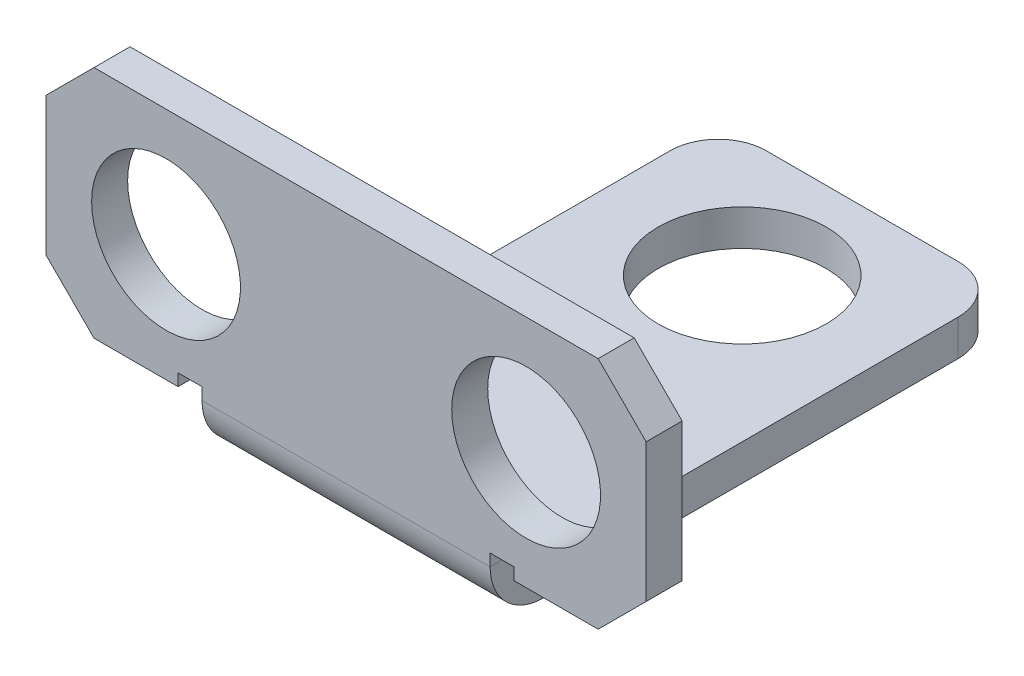
ISO-10303-21;
HEADER;
FILE_DESCRIPTION(('STEP AP214'),'2;1');
FILE_NAME('part.step','',(''),(''),'','','');
FILE_SCHEMA(('AUTOMOTIVE_DESIGN { 1 0 10303 214 1 1 1 1 }'));
ENDSEC;
DATA;
#1=APPLICATION_CONTEXT('core data for automotive mechanical design processes');
#2=APPLICATION_PROTOCOL_DEFINITION('international standard','automotive_design',2000,#1);
#3=PRODUCT_CONTEXT('',#1,'mechanical');
#4=PRODUCT('Part','Part','',(#3));
#5=PRODUCT_RELATED_PRODUCT_CATEGORY('part','',(#4));
#6=PRODUCT_DEFINITION_FORMATION('','',#4);
#7=PRODUCT_DEFINITION_CONTEXT('part definition',#1,'design');
#8=PRODUCT_DEFINITION('design','',#6,#7);
#9=PRODUCT_DEFINITION_SHAPE('','',#8);
#10=(LENGTH_UNIT() NAMED_UNIT(*) SI_UNIT(.MILLI.,.METRE.));
#11=(NAMED_UNIT(*) PLANE_ANGLE_UNIT() SI_UNIT($,.RADIAN.));
#12=(NAMED_UNIT(*) SI_UNIT($,.STERADIAN.) SOLID_ANGLE_UNIT());
#13=UNCERTAINTY_MEASURE_WITH_UNIT(LENGTH_MEASURE(1.E-05),#10,'distance_accuracy_value','');
#14=(GEOMETRIC_REPRESENTATION_CONTEXT(3) GLOBAL_UNCERTAINTY_ASSIGNED_CONTEXT((#13)) GLOBAL_UNIT_ASSIGNED_CONTEXT((#10,
#11,#12)) REPRESENTATION_CONTEXT('',''));
#15=CARTESIAN_POINT('',(0.,0.,0.));
#16=DIRECTION('',(0.,0.,1.));
#17=DIRECTION('',(1.,0.,0.));
#18=AXIS2_PLACEMENT_3D('',#15,#16,#17);
#19=CARTESIAN_POINT('',(6.,1.2366,9.25));
#20=DIRECTION('',(-1.,0.,0.));
#21=DIRECTION('',(0.,0.,1.));
#22=AXIS2_PLACEMENT_3D('',#19,#20,#21);
#23=PLANE('',#22);
#24=DIRECTION('',(0.,-1.,0.));
#25=VECTOR('',#24,1.);
#26=CARTESIAN_POINT('',(6.,0.9866,10.75));
#27=LINE('',#26,#25);
#28=CARTESIAN_POINT('',(6.,1.2366,10.75));
#29=VERTEX_POINT('',#28);
#30=CARTESIAN_POINT('',(6.,0.7366,10.75));
#31=VERTEX_POINT('',#30);
#32=EDGE_CURVE('E411',#29,#31,#27,.T.);
#33=ORIENTED_EDGE('',*,*,#32,.T.);
#34=DIRECTION('',(0.,0.,1.));
#35=VECTOR('',#34,1.);
#36=CARTESIAN_POINT('',(6.,0.7366,9.25));
#37=LINE('',#36,#35);
#38=CARTESIAN_POINT('',(6.,0.7366,9.25));
#39=VERTEX_POINT('',#38);
#40=EDGE_CURVE('E172',#39,#31,#37,.T.);
#41=ORIENTED_EDGE('',*,*,#40,.F.);
#42=DIRECTION('',(0.,-1.,0.));
#43=VECTOR('',#42,1.);
#44=CARTESIAN_POINT('',(6.,1.2366,9.25));
#45=LINE('',#44,#43);
#46=CARTESIAN_POINT('',(6.,1.2366,9.25));
#47=VERTEX_POINT('',#46);
#48=EDGE_CURVE('E328',#47,#39,#45,.T.);
#49=ORIENTED_EDGE('',*,*,#48,.F.);
#50=DIRECTION('',(0.,0.,-1.));
#51=VECTOR('',#50,1.);
#52=CARTESIAN_POINT('',(6.,1.2366,9.25));
#53=LINE('',#52,#51);
#54=EDGE_CURVE('E11',#29,#47,#53,.T.);
#55=ORIENTED_EDGE('',*,*,#54,.F.);
#56=EDGE_LOOP('',(#33,#41,#49,#55));
#57=FACE_BOUND('',#56,.T.);
#58=ADVANCED_FACE('F17',(#57),#23,.F.);
#59=CARTESIAN_POINT('',(6.,1.2366,9.25));
#60=DIRECTION('',(0.,1.,0.));
#61=DIRECTION('',(1.,0.,0.));
#62=AXIS2_PLACEMENT_3D('',#59,#60,#61);
#63=PLANE('',#62);
#64=DIRECTION('',(0.,0.,-1.));
#65=VECTOR('',#64,1.);
#66=CARTESIAN_POINT('',(7.,1.2366,9.25));
#67=LINE('',#66,#65);
#68=CARTESIAN_POINT('',(7.,1.2366,10.75));
#69=VERTEX_POINT('',#68);
#70=CARTESIAN_POINT('',(7.,1.2366,9.25));
#71=VERTEX_POINT('',#70);
#72=EDGE_CURVE('E26',#69,#71,#67,.T.);
#73=ORIENTED_EDGE('',*,*,#72,.F.);
#74=DIRECTION('',(-1.,0.,0.));
#75=VECTOR('',#74,1.);
#76=CARTESIAN_POINT('',(6.5,1.2366,10.75));
#77=LINE('',#76,#75);
#78=EDGE_CURVE('E423',#69,#29,#77,.T.);
#79=ORIENTED_EDGE('',*,*,#78,.T.);
#80=ORIENTED_EDGE('',*,*,#54,.T.);
#81=DIRECTION('',(-1.,0.,0.));
#82=VECTOR('',#81,1.);
#83=CARTESIAN_POINT('',(6.,1.2366,9.25));
#84=LINE('',#83,#82);
#85=EDGE_CURVE('E327',#71,#47,#84,.T.);
#86=ORIENTED_EDGE('',*,*,#85,.F.);
#87=EDGE_LOOP('',(#73,#79,#80,#86));
#88=FACE_BOUND('',#87,.T.);
#89=ADVANCED_FACE('F587',(#88),#63,.F.);
#90=CARTESIAN_POINT('',(7.,1.2366,9.25));
#91=DIRECTION('',(1.,0.,0.));
#92=DIRECTION('',(0.,1.,0.));
#93=AXIS2_PLACEMENT_3D('',#90,#91,#92);
#94=PLANE('',#93);
#95=DIRECTION('',(0.,0.,-1.));
#96=VECTOR('',#95,1.);
#97=CARTESIAN_POINT('',(7.,0.7366,9.25));
#98=LINE('',#97,#96);
#99=CARTESIAN_POINT('',(7.,0.7366,10.75));
#100=VERTEX_POINT('',#99);
#101=CARTESIAN_POINT('',(7.,0.7366,9.25));
#102=VERTEX_POINT('',#101);
#103=EDGE_CURVE('E346',#100,#102,#98,.T.);
#104=ORIENTED_EDGE('',*,*,#103,.F.);
#105=DIRECTION('',(0.,1.,0.));
#106=VECTOR('',#105,1.);
#107=CARTESIAN_POINT('',(7.,0.9866,10.75));
#108=LINE('',#107,#106);
#109=EDGE_CURVE('E438',#100,#69,#108,.T.);
#110=ORIENTED_EDGE('',*,*,#109,.T.);
#111=ORIENTED_EDGE('',*,*,#72,.T.);
#112=DIRECTION('',(0.,1.,0.));
#113=VECTOR('',#112,1.);
#114=CARTESIAN_POINT('',(7.,1.2366,9.25));
#115=LINE('',#114,#113);
#116=EDGE_CURVE('E320',#102,#71,#115,.T.);
#117=ORIENTED_EDGE('',*,*,#116,.F.);
#118=EDGE_LOOP('',(#104,#110,#111,#117));
#119=FACE_BOUND('',#118,.T.);
#120=ADVANCED_FACE('F616',(#119),#94,.F.);
#121=CARTESIAN_POINT('',(-6.,1.2366,9.25));
#122=DIRECTION('',(1.,0.,0.));
#123=DIRECTION('',(0.,1.,0.));
#124=AXIS2_PLACEMENT_3D('',#121,#122,#123);
#125=PLANE('',#124);
#126=DIRECTION('',(0.,1.,0.));
#127=VECTOR('',#126,1.);
#128=CARTESIAN_POINT('',(-6.,0.9866,10.75));
#129=LINE('',#128,#127);
#130=CARTESIAN_POINT('',(-6.,0.7366,10.75));
#131=VERTEX_POINT('',#130);
#132=CARTESIAN_POINT('',(-6.,1.2366,10.75));
#133=VERTEX_POINT('',#132);
#134=EDGE_CURVE('E403',#131,#133,#129,.T.);
#135=ORIENTED_EDGE('',*,*,#134,.T.);
#136=DIRECTION('',(0.,0.,-1.));
#137=VECTOR('',#136,1.);
#138=CARTESIAN_POINT('',(-6.,1.2366,9.25));
#139=LINE('',#138,#137);
#140=CARTESIAN_POINT('',(-6.,1.2366,9.25));
#141=VERTEX_POINT('',#140);
#142=EDGE_CURVE('E195',#133,#141,#139,.T.);
#143=ORIENTED_EDGE('',*,*,#142,.T.);
#144=DIRECTION('',(0.,1.,0.));
#145=VECTOR('',#144,1.);
#146=CARTESIAN_POINT('',(-6.,1.2366,9.25));
#147=LINE('',#146,#145);
#148=CARTESIAN_POINT('',(-6.,0.7366,9.25));
#149=VERTEX_POINT('',#148);
#150=EDGE_CURVE('E336',#149,#141,#147,.T.);
#151=ORIENTED_EDGE('',*,*,#150,.F.);
#152=DIRECTION('',(0.,0.,1.));
#153=VECTOR('',#152,1.);
#154=CARTESIAN_POINT('',(-6.,0.7366,10.75));
#155=LINE('',#154,#153);
#156=EDGE_CURVE('E159',#149,#131,#155,.T.);
#157=ORIENTED_EDGE('',*,*,#156,.T.);
#158=EDGE_LOOP('',(#135,#143,#151,#157));
#159=FACE_BOUND('',#158,.T.);
#160=ADVANCED_FACE('F621',(#159),#125,.F.);
#161=CARTESIAN_POINT('',(-7.,1.2366,9.25));
#162=DIRECTION('',(-1.,0.,0.));
#163=DIRECTION('',(0.,0.,1.));
#164=AXIS2_PLACEMENT_3D('',#161,#162,#163);
#165=PLANE('',#164);
#166=DIRECTION('',(0.,0.,-1.));
#167=VECTOR('',#166,1.);
#168=CARTESIAN_POINT('',(-7.,1.2366,9.25));
#169=LINE('',#168,#167);
#170=CARTESIAN_POINT('',(-7.,1.2366,10.75));
#171=VERTEX_POINT('',#170);
#172=CARTESIAN_POINT('',(-7.,1.2366,9.25));
#173=VERTEX_POINT('',#172);
#174=EDGE_CURVE('E198',#171,#173,#169,.T.);
#175=ORIENTED_EDGE('',*,*,#174,.F.);
#176=DIRECTION('',(0.,-1.,0.));
#177=VECTOR('',#176,1.);
#178=CARTESIAN_POINT('',(-7.,0.9866,10.75));
#179=LINE('',#178,#177);
#180=CARTESIAN_POINT('',(-7.,0.7366,10.75));
#181=VERTEX_POINT('',#180);
#182=EDGE_CURVE('E372',#171,#181,#179,.T.);
#183=ORIENTED_EDGE('',*,*,#182,.T.);
#184=DIRECTION('',(0.,0.,-1.));
#185=VECTOR('',#184,1.);
#186=CARTESIAN_POINT('',(-7.,0.7366,9.25));
#187=LINE('',#186,#185);
#188=CARTESIAN_POINT('',(-7.,0.7366,9.25));
#189=VERTEX_POINT('',#188);
#190=EDGE_CURVE('E220',#181,#189,#187,.T.);
#191=ORIENTED_EDGE('',*,*,#190,.T.);
#192=DIRECTION('',(0.,-1.,0.));
#193=VECTOR('',#192,1.);
#194=CARTESIAN_POINT('',(-7.,1.2366,9.25));
#195=LINE('',#194,#193);
#196=EDGE_CURVE('E277',#173,#189,#195,.T.);
#197=ORIENTED_EDGE('',*,*,#196,.F.);
#198=EDGE_LOOP('',(#175,#183,#191,#197));
#199=FACE_BOUND('',#198,.T.);
#200=ADVANCED_FACE('F368',(#199),#165,.F.);
#201=CARTESIAN_POINT('',(-6.,1.2366,9.25));
#202=DIRECTION('',(0.,1.,0.));
#203=DIRECTION('',(1.,0.,0.));
#204=AXIS2_PLACEMENT_3D('',#201,#202,#203);
#205=PLANE('',#204);
#206=ORIENTED_EDGE('',*,*,#142,.F.);
#207=DIRECTION('',(-1.,0.,0.));
#208=VECTOR('',#207,1.);
#209=CARTESIAN_POINT('',(-6.5,1.2366,10.75));
#210=LINE('',#209,#208);
#211=EDGE_CURVE('E400',#133,#171,#210,.T.);
#212=ORIENTED_EDGE('',*,*,#211,.T.);
#213=ORIENTED_EDGE('',*,*,#174,.T.);
#214=DIRECTION('',(-1.,0.,0.));
#215=VECTOR('',#214,1.);
#216=CARTESIAN_POINT('',(-6.,1.2366,9.25));
#217=LINE('',#216,#215);
#218=EDGE_CURVE('E276',#141,#173,#217,.T.);
#219=ORIENTED_EDGE('',*,*,#218,.F.);
#220=EDGE_LOOP('',(#206,#212,#213,#219));
#221=FACE_BOUND('',#220,.T.);
#222=ADVANCED_FACE('F629',(#221),#205,.F.);
#223=CARTESIAN_POINT('',(7.5,5.6183,10.75));
#224=DIRECTION('',(0.,0.,-1.));
#225=DIRECTION('',(-1.,0.,0.));
#226=AXIS2_PLACEMENT_3D('',#223,#224,#225);
#227=CYLINDRICAL_SURFACE('',#226,3.1);
#228=CARTESIAN_POINT('',(7.5,5.6183,10.75));
#229=DIRECTION('',(0.,0.,-1.));
#230=DIRECTION('',(-1.,0.,0.));
#231=AXIS2_PLACEMENT_3D('',#228,#229,#230);
#232=CIRCLE('',#231,3.1);
#233=CARTESIAN_POINT('',(4.4,5.6183,10.75));
#234=VERTEX_POINT('',#233);
#235=EDGE_CURVE('E268',#234,#234,#232,.T.);
#236=ORIENTED_EDGE('',*,*,#235,.F.);
#237=EDGE_LOOP('',(#236));
#238=FACE_BOUND('',#237,.T.);
#239=CARTESIAN_POINT('',(7.5,5.6183,9.25));
#240=DIRECTION('',(0.,0.,-1.));
#241=DIRECTION('',(-1.,0.,0.));
#242=AXIS2_PLACEMENT_3D('',#239,#240,#241);
#243=CIRCLE('',#242,3.1);
#244=CARTESIAN_POINT('',(4.4,5.6183,9.25));
#245=VERTEX_POINT('',#244);
#246=EDGE_CURVE('E342',#245,#245,#243,.T.);
#247=ORIENTED_EDGE('',*,*,#246,.T.);
#248=EDGE_LOOP('',(#247));
#249=FACE_BOUND('',#248,.T.);
#250=ADVANCED_FACE('F630',(#238,#249),#227,.F.);
#251=CARTESIAN_POINT('',(-7.5,5.6183,10.75));
#252=DIRECTION('',(0.,0.,-1.));
#253=DIRECTION('',(-1.,0.,0.));
#254=AXIS2_PLACEMENT_3D('',#251,#252,#253);
#255=CYLINDRICAL_SURFACE('',#254,3.1);
#256=CARTESIAN_POINT('',(-7.5,5.6183,10.75));
#257=DIRECTION('',(0.,0.,-1.));
#258=DIRECTION('',(-1.,0.,0.));
#259=AXIS2_PLACEMENT_3D('',#256,#257,#258);
#260=CIRCLE('',#259,3.1);
#261=CARTESIAN_POINT('',(-10.6,5.6183,10.75));
#262=VERTEX_POINT('',#261);
#263=EDGE_CURVE('E272',#262,#262,#260,.T.);
#264=ORIENTED_EDGE('',*,*,#263,.F.);
#265=EDGE_LOOP('',(#264));
#266=FACE_BOUND('',#265,.T.);
#267=CARTESIAN_POINT('',(-7.5,5.6183,9.25));
#268=DIRECTION('',(0.,0.,-1.));
#269=DIRECTION('',(-1.,0.,0.));
#270=AXIS2_PLACEMENT_3D('',#267,#268,#269);
#271=CIRCLE('',#270,3.1);
#272=CARTESIAN_POINT('',(-10.6,5.6183,9.25));
#273=VERTEX_POINT('',#272);
#274=EDGE_CURVE('E345',#273,#273,#271,.T.);
#275=ORIENTED_EDGE('',*,*,#274,.T.);
#276=EDGE_LOOP('',(#275));
#277=FACE_BOUND('',#276,.T.);
#278=ADVANCED_FACE('F633',(#266,#277),#255,.F.);
#279=CARTESIAN_POINT('',(4.,-1.5,-8.75));
#280=DIRECTION('',(0.,1.,0.));
#281=DIRECTION('',(0.,0.,1.));
#282=AXIS2_PLACEMENT_3D('',#279,#280,#281);
#283=CYLINDRICAL_SURFACE('',#282,2.);
#284=CARTESIAN_POINT('',(4.,-1.5,-8.75));
#285=DIRECTION('',(0.,-1.,0.));
#286=DIRECTION('',(0.,0.,1.));
#287=AXIS2_PLACEMENT_3D('',#284,#285,#286);
#288=CIRCLE('',#287,2.);
#289=CARTESIAN_POINT('',(4.,-1.5,-10.75));
#290=VERTEX_POINT('',#289);
#291=CARTESIAN_POINT('',(6.,-1.5,-8.75));
#292=VERTEX_POINT('',#291);
#293=EDGE_CURVE('E241',#290,#292,#288,.T.);
#294=ORIENTED_EDGE('',*,*,#293,.F.);
#295=DIRECTION('',(0.,-1.,0.));
#296=VECTOR('',#295,1.);
#297=CARTESIAN_POINT('',(4.,-1.5,-10.75));
#298=LINE('',#297,#296);
#299=CARTESIAN_POINT('',(4.,0.,-10.75));
#300=VERTEX_POINT('',#299);
#301=EDGE_CURVE('E156',#300,#290,#298,.T.);
#302=ORIENTED_EDGE('',*,*,#301,.F.);
#303=CARTESIAN_POINT('',(4.,0.,-8.75));
#304=DIRECTION('',(0.,1.,0.));
#305=DIRECTION('',(0.,0.,1.));
#306=AXIS2_PLACEMENT_3D('',#303,#304,#305);
#307=CIRCLE('',#306,2.);
#308=CARTESIAN_POINT('',(6.,0.,-8.75));
#309=VERTEX_POINT('',#308);
#310=EDGE_CURVE('E151',#309,#300,#307,.T.);
#311=ORIENTED_EDGE('',*,*,#310,.F.);
#312=DIRECTION('',(0.,1.,0.));
#313=VECTOR('',#312,1.);
#314=CARTESIAN_POINT('',(6.,-1.5,-8.75));
#315=LINE('',#314,#313);
#316=EDGE_CURVE('E226',#292,#309,#315,.T.);
#317=ORIENTED_EDGE('',*,*,#316,.F.);
#318=EDGE_LOOP('',(#294,#302,#311,#317));
#319=FACE_BOUND('',#318,.T.);
#320=ADVANCED_FACE('F637',(#319),#283,.T.);
#321=CARTESIAN_POINT('',(-4.,-1.5,-8.75));
#322=DIRECTION('',(0.,1.,0.));
#323=DIRECTION('',(0.,0.,1.));
#324=AXIS2_PLACEMENT_3D('',#321,#322,#323);
#325=CYLINDRICAL_SURFACE('',#324,2.);
#326=CARTESIAN_POINT('',(-4.,-1.5,-8.75));
#327=DIRECTION('',(0.,-1.,0.));
#328=DIRECTION('',(0.,0.,1.));
#329=AXIS2_PLACEMENT_3D('',#326,#327,#328);
#330=CIRCLE('',#329,2.);
#331=CARTESIAN_POINT('',(-6.,-1.5,-8.75));
#332=VERTEX_POINT('',#331);
#333=CARTESIAN_POINT('',(-4.,-1.5,-10.75));
#334=VERTEX_POINT('',#333);
#335=EDGE_CURVE('E116',#332,#334,#330,.T.);
#336=ORIENTED_EDGE('',*,*,#335,.F.);
#337=DIRECTION('',(0.,-1.,0.));
#338=VECTOR('',#337,1.);
#339=CARTESIAN_POINT('',(-6.,-1.5,-8.75));
#340=LINE('',#339,#338);
#341=CARTESIAN_POINT('',(-6.,0.,-8.75));
#342=VERTEX_POINT('',#341);
#343=EDGE_CURVE('E109',#342,#332,#340,.T.);
#344=ORIENTED_EDGE('',*,*,#343,.F.);
#345=CARTESIAN_POINT('',(-4.,0.,-8.75));
#346=DIRECTION('',(0.,1.,0.));
#347=DIRECTION('',(0.,0.,1.));
#348=AXIS2_PLACEMENT_3D('',#345,#346,#347);
#349=CIRCLE('',#348,2.);
#350=CARTESIAN_POINT('',(-4.,0.,-10.75));
#351=VERTEX_POINT('',#350);
#352=EDGE_CURVE('E113',#351,#342,#349,.T.);
#353=ORIENTED_EDGE('',*,*,#352,.F.);
#354=DIRECTION('',(0.,1.,0.));
#355=VECTOR('',#354,1.);
#356=CARTESIAN_POINT('',(-4.,-1.5,-10.75));
#357=LINE('',#356,#355);
#358=EDGE_CURVE('E160',#334,#351,#357,.T.);
#359=ORIENTED_EDGE('',*,*,#358,.F.);
#360=EDGE_LOOP('',(#336,#344,#353,#359));
#361=FACE_BOUND('',#360,.T.);
#362=ADVANCED_FACE('F111',(#361),#325,.T.);
#363=CARTESIAN_POINT('',(12.5,2.7366,0.));
#364=DIRECTION('',(0.707106781186546,-0.70710678118655,0.));
#365=DIRECTION('',(0.,0.,-1.));
#366=AXIS2_PLACEMENT_3D('',#363,#364,#365);
#367=PLANE('',#366);
#368=DIRECTION('',(0.70710678118655,0.707106781186546,0.));
#369=VECTOR('',#368,1.);
#370=CARTESIAN_POINT('',(12.5,2.7366,10.75));
#371=LINE('',#370,#369);
#372=CARTESIAN_POINT('',(10.5,0.7366,10.75));
#373=VERTEX_POINT('',#372);
#374=CARTESIAN_POINT('',(12.5,2.7366,10.75));
#375=VERTEX_POINT('',#374);
#376=EDGE_CURVE('E419',#373,#375,#371,.T.);
#377=ORIENTED_EDGE('',*,*,#376,.F.);
#378=DIRECTION('',(0.,0.,1.));
#379=VECTOR('',#378,1.);
#380=CARTESIAN_POINT('',(10.5,0.7366,10.75));
#381=LINE('',#380,#379);
#382=CARTESIAN_POINT('',(10.5,0.7366,9.25));
#383=VERTEX_POINT('',#382);
#384=EDGE_CURVE('E349',#383,#373,#381,.T.);
#385=ORIENTED_EDGE('',*,*,#384,.F.);
#386=DIRECTION('',(-0.70710678118655,-0.707106781186546,0.));
#387=VECTOR('',#386,1.);
#388=CARTESIAN_POINT('',(4.8817,-4.8817,9.25));
#389=LINE('',#388,#387);
#390=CARTESIAN_POINT('',(12.5,2.7366,9.25));
#391=VERTEX_POINT('',#390);
#392=EDGE_CURVE('E312',#391,#383,#389,.T.);
#393=ORIENTED_EDGE('',*,*,#392,.F.);
#394=DIRECTION('',(0.,0.,-1.));
#395=VECTOR('',#394,1.);
#396=CARTESIAN_POINT('',(12.5,2.7366,9.25));
#397=LINE('',#396,#395);
#398=EDGE_CURVE('E173',#375,#391,#397,.T.);
#399=ORIENTED_EDGE('',*,*,#398,.F.);
#400=EDGE_LOOP('',(#377,#385,#393,#399));
#401=FACE_BOUND('',#400,.T.);
#402=ADVANCED_FACE('F643',(#401),#367,.T.);
#403=CARTESIAN_POINT('',(12.5,8.5,0.));
#404=DIRECTION('',(0.707106781186546,0.707106781186549,0.));
#405=DIRECTION('',(0.,0.,-1.));
#406=AXIS2_PLACEMENT_3D('',#403,#404,#405);
#407=PLANE('',#406);
#408=DIRECTION('',(0.707106781186549,-0.707106781186546,0.));
#409=VECTOR('',#408,1.);
#410=CARTESIAN_POINT('',(10.5,10.5,9.25));
#411=LINE('',#410,#409);
#412=CARTESIAN_POINT('',(10.5,10.5,9.25));
#413=VERTEX_POINT('',#412);
#414=CARTESIAN_POINT('',(12.5,8.5,9.25));
#415=VERTEX_POINT('',#414);
#416=EDGE_CURVE('E304',#413,#415,#411,.T.);
#417=ORIENTED_EDGE('',*,*,#416,.F.);
#418=DIRECTION('',(0.,0.,-1.));
#419=VECTOR('',#418,1.);
#420=CARTESIAN_POINT('',(10.5,10.5,9.25));
#421=LINE('',#420,#419);
#422=CARTESIAN_POINT('',(10.5,10.5,10.75));
#423=VERTEX_POINT('',#422);
#424=EDGE_CURVE('E183',#423,#413,#421,.T.);
#425=ORIENTED_EDGE('',*,*,#424,.F.);
#426=DIRECTION('',(-0.707106781186549,0.707106781186546,0.));
#427=VECTOR('',#426,1.);
#428=CARTESIAN_POINT('',(12.5,8.5,10.75));
#429=LINE('',#428,#427);
#430=CARTESIAN_POINT('',(12.5,8.5,10.75));
#431=VERTEX_POINT('',#430);
#432=EDGE_CURVE('E418',#431,#423,#429,.T.);
#433=ORIENTED_EDGE('',*,*,#432,.F.);
#434=DIRECTION('',(0.,0.,1.));
#435=VECTOR('',#434,1.);
#436=CARTESIAN_POINT('',(12.5,8.5,10.75));
#437=LINE('',#436,#435);
#438=EDGE_CURVE('E178',#415,#431,#437,.T.);
#439=ORIENTED_EDGE('',*,*,#438,.F.);
#440=EDGE_LOOP('',(#417,#425,#433,#439));
#441=FACE_BOUND('',#440,.T.);
#442=ADVANCED_FACE('F646',(#441),#407,.T.);
#443=CARTESIAN_POINT('',(-12.5,8.5,0.));
#444=DIRECTION('',(-0.707106781186546,0.707106781186549,0.));
#445=DIRECTION('',(0.,0.,1.));
#446=AXIS2_PLACEMENT_3D('',#443,#444,#445);
#447=PLANE('',#446);
#448=DIRECTION('',(-0.707106781186549,-0.707106781186546,0.));
#449=VECTOR('',#448,1.);
#450=CARTESIAN_POINT('',(-12.5,8.5,10.75));
#451=LINE('',#450,#449);
#452=CARTESIAN_POINT('',(-10.5,10.5,10.75));
#453=VERTEX_POINT('',#452);
#454=CARTESIAN_POINT('',(-12.5,8.5,10.75));
#455=VERTEX_POINT('',#454);
#456=EDGE_CURVE('E449',#453,#455,#451,.T.);
#457=ORIENTED_EDGE('',*,*,#456,.F.);
#458=DIRECTION('',(0.,0.,1.));
#459=VECTOR('',#458,1.);
#460=CARTESIAN_POINT('',(-10.5,10.5,10.75));
#461=LINE('',#460,#459);
#462=CARTESIAN_POINT('',(-10.5,10.5,9.25));
#463=VERTEX_POINT('',#462);
#464=EDGE_CURVE('E179',#463,#453,#461,.T.);
#465=ORIENTED_EDGE('',*,*,#464,.F.);
#466=DIRECTION('',(0.707106781186549,0.707106781186546,0.));
#467=VECTOR('',#466,1.);
#468=CARTESIAN_POINT('',(-10.5,10.5,9.25));
#469=LINE('',#468,#467);
#470=CARTESIAN_POINT('',(-12.5,8.5,9.25));
#471=VERTEX_POINT('',#470);
#472=EDGE_CURVE('E296',#471,#463,#469,.T.);
#473=ORIENTED_EDGE('',*,*,#472,.F.);
#474=DIRECTION('',(0.,0.,-1.));
#475=VECTOR('',#474,1.);
#476=CARTESIAN_POINT('',(-12.5,8.5,9.25));
#477=LINE('',#476,#475);
#478=EDGE_CURVE('E191',#455,#471,#477,.T.);
#479=ORIENTED_EDGE('',*,*,#478,.F.);
#480=EDGE_LOOP('',(#457,#465,#473,#479));
#481=FACE_BOUND('',#480,.T.);
#482=ADVANCED_FACE('F652',(#481),#447,.T.);
#483=CARTESIAN_POINT('',(-12.5,2.7366,0.));
#484=DIRECTION('',(-0.707106781186546,-0.70710678118655,0.));
#485=DIRECTION('',(-0.70710678118655,0.707106781186546,0.));
#486=AXIS2_PLACEMENT_3D('',#483,#484,#485);
#487=PLANE('',#486);
#488=DIRECTION('',(-0.70710678118655,0.707106781186546,0.));
#489=VECTOR('',#488,1.);
#490=CARTESIAN_POINT('',(-4.8817,-4.8817,9.25));
#491=LINE('',#490,#489);
#492=CARTESIAN_POINT('',(-10.5,0.7366,9.25));
#493=VERTEX_POINT('',#492);
#494=CARTESIAN_POINT('',(-12.5,2.7366,9.25));
#495=VERTEX_POINT('',#494);
#496=EDGE_CURVE('E285',#493,#495,#491,.T.);
#497=ORIENTED_EDGE('',*,*,#496,.F.);
#498=DIRECTION('',(0.,0.,-1.));
#499=VECTOR('',#498,1.);
#500=CARTESIAN_POINT('',(-10.5,0.7366,9.25));
#501=LINE('',#500,#499);
#502=CARTESIAN_POINT('',(-10.5,0.7366,10.75));
#503=VERTEX_POINT('',#502);
#504=EDGE_CURVE('E227',#503,#493,#501,.T.);
#505=ORIENTED_EDGE('',*,*,#504,.F.);
#506=DIRECTION('',(0.70710678118655,-0.707106781186546,0.));
#507=VECTOR('',#506,1.);
#508=CARTESIAN_POINT('',(-12.5,2.7366,10.75));
#509=LINE('',#508,#507);
#510=CARTESIAN_POINT('',(-12.5,2.7366,10.75));
#511=VERTEX_POINT('',#510);
#512=EDGE_CURVE('E262',#511,#503,#509,.T.);
#513=ORIENTED_EDGE('',*,*,#512,.F.);
#514=DIRECTION('',(0.,0.,1.));
#515=VECTOR('',#514,1.);
#516=CARTESIAN_POINT('',(-12.5,2.7366,10.75));
#517=LINE('',#516,#515);
#518=EDGE_CURVE('E177',#495,#511,#517,.T.);
#519=ORIENTED_EDGE('',*,*,#518,.F.);
#520=EDGE_LOOP('',(#497,#505,#513,#519));
#521=FACE_BOUND('',#520,.T.);
#522=ADVANCED_FACE('F655',(#521),#487,.T.);
#523=CARTESIAN_POINT('',(0.,10.5,-5.75));
#524=DIRECTION('',(0.,-1.,0.));
#525=DIRECTION('',(0.,0.,-1.));
#526=AXIS2_PLACEMENT_3D('',#523,#524,#525);
#527=CYLINDRICAL_SURFACE('',#526,3.5);
#528=CARTESIAN_POINT('',(0.,0.,-5.75));
#529=DIRECTION('',(0.,1.,0.));
#530=DIRECTION('',(0.,0.,1.));
#531=AXIS2_PLACEMENT_3D('',#528,#529,#530);
#532=CIRCLE('',#531,3.5);
#533=CARTESIAN_POINT('',(0.,0.,-2.25));
#534=VERTEX_POINT('',#533);
#535=EDGE_CURVE('E37',#534,#534,#532,.T.);
#536=ORIENTED_EDGE('',*,*,#535,.T.);
#537=EDGE_LOOP('',(#536));
#538=FACE_BOUND('',#537,.T.);
#539=CARTESIAN_POINT('',(0.,-1.5,-5.75));
#540=DIRECTION('',(0.,-1.,0.));
#541=DIRECTION('',(0.,0.,-1.));
#542=AXIS2_PLACEMENT_3D('',#539,#540,#541);
#543=CIRCLE('',#542,3.5);
#544=CARTESIAN_POINT('',(0.,-1.5,-9.25));
#545=VERTEX_POINT('',#544);
#546=EDGE_CURVE('E144',#545,#545,#543,.T.);
#547=ORIENTED_EDGE('',*,*,#546,.T.);
#548=EDGE_LOOP('',(#547));
#549=FACE_BOUND('',#548,.T.);
#550=ADVANCED_FACE('F659',(#538,#549),#527,.F.);
#551=CARTESIAN_POINT('',(-12.5,0.,0.));
#552=DIRECTION('',(-1.,0.,0.));
#553=DIRECTION('',(0.,0.,1.));
#554=AXIS2_PLACEMENT_3D('',#551,#552,#553);
#555=PLANE('',#554);
#556=DIRECTION('',(0.,-1.,0.));
#557=VECTOR('',#556,1.);
#558=CARTESIAN_POINT('',(-12.5,10.5,9.25));
#559=LINE('',#558,#557);
#560=EDGE_CURVE('E292',#471,#495,#559,.T.);
#561=ORIENTED_EDGE('',*,*,#560,.T.);
#562=ORIENTED_EDGE('',*,*,#518,.T.);
#563=DIRECTION('',(0.,1.,0.));
#564=VECTOR('',#563,1.);
#565=CARTESIAN_POINT('',(-12.5,0.7366,10.75));
#566=LINE('',#565,#564);
#567=EDGE_CURVE('E267',#511,#455,#566,.T.);
#568=ORIENTED_EDGE('',*,*,#567,.T.);
#569=ORIENTED_EDGE('',*,*,#478,.T.);
#570=EDGE_LOOP('',(#561,#562,#568,#569));
#571=FACE_BOUND('',#570,.T.);
#572=ADVANCED_FACE('F662',(#571),#555,.T.);
#573=CARTESIAN_POINT('',(12.5,0.,0.));
#574=DIRECTION('',(1.,0.,0.));
#575=DIRECTION('',(0.,1.,0.));
#576=AXIS2_PLACEMENT_3D('',#573,#574,#575);
#577=PLANE('',#576);
#578=DIRECTION('',(0.,1.,0.));
#579=VECTOR('',#578,1.);
#580=CARTESIAN_POINT('',(12.5,0.7366,9.25));
#581=LINE('',#580,#579);
#582=EDGE_CURVE('E308',#391,#415,#581,.T.);
#583=ORIENTED_EDGE('',*,*,#582,.T.);
#584=ORIENTED_EDGE('',*,*,#438,.T.);
#585=DIRECTION('',(0.,-1.,0.));
#586=VECTOR('',#585,1.);
#587=CARTESIAN_POINT('',(12.5,10.5,10.75));
#588=LINE('',#587,#586);
#589=EDGE_CURVE('E414',#431,#375,#588,.T.);
#590=ORIENTED_EDGE('',*,*,#589,.T.);
#591=ORIENTED_EDGE('',*,*,#398,.T.);
#592=EDGE_LOOP('',(#583,#584,#590,#591));
#593=FACE_BOUND('',#592,.T.);
#594=ADVANCED_FACE('F664',(#593),#577,.T.);
#595=CARTESIAN_POINT('',(-6.,10.5,10.75));
#596=DIRECTION('',(0.,-1.,0.));
#597=DIRECTION('',(0.,0.,-1.));
#598=AXIS2_PLACEMENT_3D('',#595,#596,#597);
#599=PLANE('',#598);
#600=DIRECTION('',(-1.,0.,0.));
#601=VECTOR('',#600,1.);
#602=CARTESIAN_POINT('',(-6.,10.5,9.25));
#603=LINE('',#602,#601);
#604=EDGE_CURVE('E300',#413,#463,#603,.T.);
#605=ORIENTED_EDGE('',*,*,#604,.T.);
#606=ORIENTED_EDGE('',*,*,#464,.T.);
#607=DIRECTION('',(-1.,0.,0.));
#608=VECTOR('',#607,1.);
#609=CARTESIAN_POINT('',(0.,10.5,10.75));
#610=LINE('',#609,#608);
#611=EDGE_CURVE('E458',#423,#453,#610,.T.);
#612=ORIENTED_EDGE('',*,*,#611,.F.);
#613=ORIENTED_EDGE('',*,*,#424,.T.);
#614=EDGE_LOOP('',(#605,#606,#612,#613));
#615=FACE_BOUND('',#614,.T.);
#616=ADVANCED_FACE('F480',(#615),#599,.F.);
#617=CARTESIAN_POINT('',(6.,0.7366,8.5134));
#618=DIRECTION('',(1.,0.,0.));
#619=DIRECTION('',(0.,0.,1.));
#620=AXIS2_PLACEMENT_3D('',#617,#618,#619);
#621=CYLINDRICAL_SURFACE('',#620,0.7366);
#622=DIRECTION('',(-1.,0.,0.));
#623=VECTOR('',#622,1.);
#624=CARTESIAN_POINT('',(6.,0.,8.5134));
#625=LINE('',#624,#623);
#626=CARTESIAN_POINT('',(6.,0.,8.5134));
#627=VERTEX_POINT('',#626);
#628=CARTESIAN_POINT('',(-6.,0.,8.5134));
#629=VERTEX_POINT('',#628);
#630=EDGE_CURVE('E132',#627,#629,#625,.T.);
#631=ORIENTED_EDGE('',*,*,#630,.T.);
#632=CARTESIAN_POINT('',(-6.,0.7366,8.5134));
#633=DIRECTION('',(-1.,0.,0.));
#634=DIRECTION('',(0.,0.,-1.));
#635=AXIS2_PLACEMENT_3D('',#632,#633,#634);
#636=CIRCLE('',#635,0.7366);
#637=EDGE_CURVE('E161',#629,#149,#636,.T.);
#638=ORIENTED_EDGE('',*,*,#637,.T.);
#639=DIRECTION('',(1.,0.,0.));
#640=VECTOR('',#639,1.);
#641=CARTESIAN_POINT('',(-6.,0.7366,9.25));
#642=LINE('',#641,#640);
#643=EDGE_CURVE('E331',#149,#39,#642,.T.);
#644=ORIENTED_EDGE('',*,*,#643,.T.);
#645=CARTESIAN_POINT('',(6.,0.7366,8.5134));
#646=DIRECTION('',(1.,0.,0.));
#647=DIRECTION('',(0.,0.,-1.));
#648=AXIS2_PLACEMENT_3D('',#645,#646,#647);
#649=CIRCLE('',#648,0.7366);
#650=EDGE_CURVE('E169',#39,#627,#649,.T.);
#651=ORIENTED_EDGE('',*,*,#650,.T.);
#652=EDGE_LOOP('',(#631,#638,#644,#651));
#653=FACE_BOUND('',#652,.T.);
#654=ADVANCED_FACE('F584',(#653),#621,.F.);
#655=CARTESIAN_POINT('',(6.,0.7366,8.5134));
#656=DIRECTION('',(1.,0.,0.));
#657=DIRECTION('',(0.,0.,1.));
#658=AXIS2_PLACEMENT_3D('',#655,#656,#657);
#659=CYLINDRICAL_SURFACE('',#658,2.2366);
#660=DIRECTION('',(-1.,0.,0.));
#661=VECTOR('',#660,1.);
#662=CARTESIAN_POINT('',(6.,-1.5,8.5134));
#663=LINE('',#662,#661);
#664=CARTESIAN_POINT('',(6.,-1.5,8.5134));
#665=VERTEX_POINT('',#664);
#666=CARTESIAN_POINT('',(-6.,-1.5,8.5134));
#667=VERTEX_POINT('',#666);
#668=EDGE_CURVE('E243',#665,#667,#663,.T.);
#669=ORIENTED_EDGE('',*,*,#668,.F.);
#670=CARTESIAN_POINT('',(6.,0.7366,8.5134));
#671=DIRECTION('',(1.,0.,0.));
#672=DIRECTION('',(0.,0.,-1.));
#673=AXIS2_PLACEMENT_3D('',#670,#671,#672);
#674=CIRCLE('',#673,2.2366);
#675=EDGE_CURVE('E184',#31,#665,#674,.T.);
#676=ORIENTED_EDGE('',*,*,#675,.F.);
#677=DIRECTION('',(-1.,0.,0.));
#678=VECTOR('',#677,1.);
#679=CARTESIAN_POINT('',(-6.,0.7366,10.75));
#680=LINE('',#679,#678);
#681=EDGE_CURVE('E407',#31,#131,#680,.T.);
#682=ORIENTED_EDGE('',*,*,#681,.T.);
#683=CARTESIAN_POINT('',(-6.,0.7366,8.5134));
#684=DIRECTION('',(-1.,0.,0.));
#685=DIRECTION('',(0.,0.,-1.));
#686=AXIS2_PLACEMENT_3D('',#683,#684,#685);
#687=CIRCLE('',#686,2.2366);
#688=EDGE_CURVE('E165',#667,#131,#687,.T.);
#689=ORIENTED_EDGE('',*,*,#688,.F.);
#690=EDGE_LOOP('',(#669,#676,#682,#689));
#691=FACE_BOUND('',#690,.T.);
#692=ADVANCED_FACE('F594',(#691),#659,.T.);
#693=CARTESIAN_POINT('',(6.,0.7366,8.5134));
#694=DIRECTION('',(-1.,0.,0.));
#695=DIRECTION('',(0.,0.,1.));
#696=AXIS2_PLACEMENT_3D('',#693,#694,#695);
#697=PLANE('',#696);
#698=ORIENTED_EDGE('',*,*,#650,.F.);
#699=ORIENTED_EDGE('',*,*,#40,.T.);
#700=ORIENTED_EDGE('',*,*,#675,.T.);
#701=DIRECTION('',(0.,-1.,0.));
#702=VECTOR('',#701,1.);
#703=CARTESIAN_POINT('',(6.,0.,8.5134));
#704=LINE('',#703,#702);
#705=EDGE_CURVE('E232',#627,#665,#704,.T.);
#706=ORIENTED_EDGE('',*,*,#705,.F.);
#707=EDGE_LOOP('',(#698,#699,#700,#706));
#708=FACE_BOUND('',#707,.T.);
#709=ADVANCED_FACE('F581',(#708),#697,.F.);
#710=CARTESIAN_POINT('',(-6.,0.7366,8.5134));
#711=DIRECTION('',(-1.,0.,0.));
#712=DIRECTION('',(0.,0.,1.));
#713=AXIS2_PLACEMENT_3D('',#710,#711,#712);
#714=PLANE('',#713);
#715=ORIENTED_EDGE('',*,*,#156,.F.);
#716=ORIENTED_EDGE('',*,*,#637,.F.);
#717=DIRECTION('',(0.,-1.,0.));
#718=VECTOR('',#717,1.);
#719=CARTESIAN_POINT('',(-6.,0.,8.5134));
#720=LINE('',#719,#718);
#721=EDGE_CURVE('E121',#629,#667,#720,.T.);
#722=ORIENTED_EDGE('',*,*,#721,.T.);
#723=ORIENTED_EDGE('',*,*,#688,.T.);
#724=EDGE_LOOP('',(#715,#716,#722,#723));
#725=FACE_BOUND('',#724,.T.);
#726=ADVANCED_FACE('F674',(#725),#714,.T.);
#727=CARTESIAN_POINT('',(6.,-1.5,-10.75));
#728=DIRECTION('',(0.,0.,-1.));
#729=DIRECTION('',(-1.,0.,0.));
#730=AXIS2_PLACEMENT_3D('',#727,#728,#729);
#731=PLANE('',#730);
#732=DIRECTION('',(-1.,0.,0.));
#733=VECTOR('',#732,1.);
#734=CARTESIAN_POINT('',(6.,-1.5,-10.75));
#735=LINE('',#734,#733);
#736=EDGE_CURVE('E240',#290,#334,#735,.T.);
#737=ORIENTED_EDGE('',*,*,#736,.T.);
#738=ORIENTED_EDGE('',*,*,#358,.T.);
#739=DIRECTION('',(-1.,0.,0.));
#740=VECTOR('',#739,1.);
#741=CARTESIAN_POINT('',(6.,0.,-10.75));
#742=LINE('',#741,#740);
#743=EDGE_CURVE('E137',#300,#351,#742,.T.);
#744=ORIENTED_EDGE('',*,*,#743,.F.);
#745=ORIENTED_EDGE('',*,*,#301,.T.);
#746=EDGE_LOOP('',(#737,#738,#744,#745));
#747=FACE_BOUND('',#746,.T.);
#748=ADVANCED_FACE('F679',(#747),#731,.T.);
#749=CARTESIAN_POINT('',(-6.,-1.5,10.75));
#750=DIRECTION('',(-1.,0.,0.));
#751=DIRECTION('',(0.,0.,1.));
#752=AXIS2_PLACEMENT_3D('',#749,#750,#751);
#753=PLANE('',#752);
#754=DIRECTION('',(0.,0.,1.));
#755=VECTOR('',#754,1.);
#756=CARTESIAN_POINT('',(-6.,0.,10.75));
#757=LINE('',#756,#755);
#758=EDGE_CURVE('E125',#342,#629,#757,.T.);
#759=ORIENTED_EDGE('',*,*,#758,.F.);
#760=ORIENTED_EDGE('',*,*,#343,.T.);
#761=DIRECTION('',(0.,0.,1.));
#762=VECTOR('',#761,1.);
#763=CARTESIAN_POINT('',(-6.,-1.5,10.75));
#764=LINE('',#763,#762);
#765=EDGE_CURVE('E236',#332,#667,#764,.T.);
#766=ORIENTED_EDGE('',*,*,#765,.T.);
#767=ORIENTED_EDGE('',*,*,#721,.F.);
#768=EDGE_LOOP('',(#759,#760,#766,#767));
#769=FACE_BOUND('',#768,.T.);
#770=ADVANCED_FACE('F126',(#769),#753,.T.);
#771=CARTESIAN_POINT('',(0.,0.,0.));
#772=DIRECTION('',(0.,1.,0.));
#773=DIRECTION('',(1.,0.,0.));
#774=AXIS2_PLACEMENT_3D('',#771,#772,#773);
#775=PLANE('',#774);
#776=ORIENTED_EDGE('',*,*,#535,.F.);
#777=EDGE_LOOP('',(#776));
#778=FACE_BOUND('',#777,.T.);
#779=ORIENTED_EDGE('',*,*,#743,.T.);
#780=ORIENTED_EDGE('',*,*,#352,.T.);
#781=ORIENTED_EDGE('',*,*,#758,.T.);
#782=ORIENTED_EDGE('',*,*,#630,.F.);
#783=DIRECTION('',(0.,0.,-1.));
#784=VECTOR('',#783,1.);
#785=CARTESIAN_POINT('',(6.,0.,10.75));
#786=LINE('',#785,#784);
#787=EDGE_CURVE('E228',#627,#309,#786,.T.);
#788=ORIENTED_EDGE('',*,*,#787,.T.);
#789=ORIENTED_EDGE('',*,*,#310,.T.);
#790=EDGE_LOOP('',(#779,#780,#781,#782,#788,#789));
#791=FACE_BOUND('',#790,.T.);
#792=ADVANCED_FACE('F134',(#778,#791),#775,.T.);
#793=CARTESIAN_POINT('',(0.,-1.5,0.));
#794=DIRECTION('',(0.,1.,0.));
#795=DIRECTION('',(1.,0.,0.));
#796=AXIS2_PLACEMENT_3D('',#793,#794,#795);
#797=PLANE('',#796);
#798=ORIENTED_EDGE('',*,*,#546,.F.);
#799=EDGE_LOOP('',(#798));
#800=FACE_BOUND('',#799,.T.);
#801=ORIENTED_EDGE('',*,*,#765,.F.);
#802=ORIENTED_EDGE('',*,*,#335,.T.);
#803=ORIENTED_EDGE('',*,*,#736,.F.);
#804=ORIENTED_EDGE('',*,*,#293,.T.);
#805=DIRECTION('',(0.,0.,-1.));
#806=VECTOR('',#805,1.);
#807=CARTESIAN_POINT('',(6.,-1.5,10.75));
#808=LINE('',#807,#806);
#809=EDGE_CURVE('E222',#665,#292,#808,.T.);
#810=ORIENTED_EDGE('',*,*,#809,.F.);
#811=ORIENTED_EDGE('',*,*,#668,.T.);
#812=EDGE_LOOP('',(#801,#802,#803,#804,#810,#811));
#813=FACE_BOUND('',#812,.T.);
#814=ADVANCED_FACE('F597',(#800,#813),#797,.F.);
#815=CARTESIAN_POINT('',(6.,-1.5,10.75));
#816=DIRECTION('',(1.,0.,0.));
#817=DIRECTION('',(0.,1.,0.));
#818=AXIS2_PLACEMENT_3D('',#815,#816,#817);
#819=PLANE('',#818);
#820=ORIENTED_EDGE('',*,*,#809,.T.);
#821=ORIENTED_EDGE('',*,*,#316,.T.);
#822=ORIENTED_EDGE('',*,*,#787,.F.);
#823=ORIENTED_EDGE('',*,*,#705,.T.);
#824=EDGE_LOOP('',(#820,#821,#822,#823));
#825=FACE_BOUND('',#824,.T.);
#826=ADVANCED_FACE('F596',(#825),#819,.T.);
#827=CARTESIAN_POINT('',(-12.5,0.7366,9.25));
#828=DIRECTION('',(0.,1.,0.));
#829=DIRECTION('',(1.,0.,0.));
#830=AXIS2_PLACEMENT_3D('',#827,#828,#829);
#831=PLANE('',#830);
#832=ORIENTED_EDGE('',*,*,#190,.F.);
#833=DIRECTION('',(1.,0.,0.));
#834=VECTOR('',#833,1.);
#835=CARTESIAN_POINT('',(-12.5,0.7366,10.75));
#836=LINE('',#835,#834);
#837=EDGE_CURVE('E266',#503,#181,#836,.T.);
#838=ORIENTED_EDGE('',*,*,#837,.F.);
#839=ORIENTED_EDGE('',*,*,#504,.T.);
#840=DIRECTION('',(1.,0.,0.));
#841=VECTOR('',#840,1.);
#842=CARTESIAN_POINT('',(-12.5,0.7366,9.25));
#843=LINE('',#842,#841);
#844=EDGE_CURVE('E281',#493,#189,#843,.T.);
#845=ORIENTED_EDGE('',*,*,#844,.T.);
#846=EDGE_LOOP('',(#832,#838,#839,#845));
#847=FACE_BOUND('',#846,.T.);
#848=ADVANCED_FACE('F380',(#847),#831,.F.);
#849=CARTESIAN_POINT('',(12.5,0.7366,10.75));
#850=DIRECTION('',(0.,1.,0.));
#851=DIRECTION('',(1.,0.,0.));
#852=AXIS2_PLACEMENT_3D('',#849,#850,#851);
#853=PLANE('',#852);
#854=ORIENTED_EDGE('',*,*,#103,.T.);
#855=DIRECTION('',(-1.,0.,0.));
#856=VECTOR('',#855,1.);
#857=CARTESIAN_POINT('',(12.5,0.7366,9.25));
#858=LINE('',#857,#856);
#859=EDGE_CURVE('E316',#383,#102,#858,.T.);
#860=ORIENTED_EDGE('',*,*,#859,.F.);
#861=ORIENTED_EDGE('',*,*,#384,.T.);
#862=DIRECTION('',(-1.,0.,0.));
#863=VECTOR('',#862,1.);
#864=CARTESIAN_POINT('',(12.5,0.7366,10.75));
#865=LINE('',#864,#863);
#866=EDGE_CURVE('E442',#373,#100,#865,.T.);
#867=ORIENTED_EDGE('',*,*,#866,.T.);
#868=EDGE_LOOP('',(#854,#860,#861,#867));
#869=FACE_BOUND('',#868,.T.);
#870=ADVANCED_FACE('F697',(#869),#853,.F.);
#871=CARTESIAN_POINT('',(0.,0.,9.25));
#872=DIRECTION('',(0.,0.,-1.));
#873=DIRECTION('',(0.,-1.,0.));
#874=AXIS2_PLACEMENT_3D('',#871,#872,#873);
#875=PLANE('',#874);
#876=ORIENTED_EDGE('',*,*,#274,.F.);
#877=EDGE_LOOP('',(#876));
#878=FACE_BOUND('',#877,.T.);
#879=ORIENTED_EDGE('',*,*,#246,.F.);
#880=EDGE_LOOP('',(#879));
#881=FACE_BOUND('',#880,.T.);
#882=ORIENTED_EDGE('',*,*,#218,.T.);
#883=ORIENTED_EDGE('',*,*,#196,.T.);
#884=ORIENTED_EDGE('',*,*,#844,.F.);
#885=ORIENTED_EDGE('',*,*,#496,.T.);
#886=ORIENTED_EDGE('',*,*,#560,.F.);
#887=ORIENTED_EDGE('',*,*,#472,.T.);
#888=ORIENTED_EDGE('',*,*,#604,.F.);
#889=ORIENTED_EDGE('',*,*,#416,.T.);
#890=ORIENTED_EDGE('',*,*,#582,.F.);
#891=ORIENTED_EDGE('',*,*,#392,.T.);
#892=ORIENTED_EDGE('',*,*,#859,.T.);
#893=ORIENTED_EDGE('',*,*,#116,.T.);
#894=ORIENTED_EDGE('',*,*,#85,.T.);
#895=ORIENTED_EDGE('',*,*,#48,.T.);
#896=ORIENTED_EDGE('',*,*,#643,.F.);
#897=ORIENTED_EDGE('',*,*,#150,.T.);
#898=EDGE_LOOP('',(#882,#883,#884,#885,#886,#887,#888,#889,#890,#891,#892,#893,#894,#895,#896,#897));
#899=FACE_BOUND('',#898,.T.);
#900=ADVANCED_FACE('F384',(#878,#881,#899),#875,.T.);
#901=CARTESIAN_POINT('',(0.,0.,10.75));
#902=DIRECTION('',(0.,0.,-1.));
#903=DIRECTION('',(0.,-1.,0.));
#904=AXIS2_PLACEMENT_3D('',#901,#902,#903);
#905=PLANE('',#904);
#906=ORIENTED_EDGE('',*,*,#263,.T.);
#907=EDGE_LOOP('',(#906));
#908=FACE_BOUND('',#907,.T.);
#909=ORIENTED_EDGE('',*,*,#235,.T.);
#910=EDGE_LOOP('',(#909));
#911=FACE_BOUND('',#910,.T.);
#912=ORIENTED_EDGE('',*,*,#182,.F.);
#913=ORIENTED_EDGE('',*,*,#211,.F.);
#914=ORIENTED_EDGE('',*,*,#134,.F.);
#915=ORIENTED_EDGE('',*,*,#681,.F.);
#916=ORIENTED_EDGE('',*,*,#32,.F.);
#917=ORIENTED_EDGE('',*,*,#78,.F.);
#918=ORIENTED_EDGE('',*,*,#109,.F.);
#919=ORIENTED_EDGE('',*,*,#866,.F.);
#920=ORIENTED_EDGE('',*,*,#376,.T.);
#921=ORIENTED_EDGE('',*,*,#589,.F.);
#922=ORIENTED_EDGE('',*,*,#432,.T.);
#923=ORIENTED_EDGE('',*,*,#611,.T.);
#924=ORIENTED_EDGE('',*,*,#456,.T.);
#925=ORIENTED_EDGE('',*,*,#567,.F.);
#926=ORIENTED_EDGE('',*,*,#512,.T.);
#927=ORIENTED_EDGE('',*,*,#837,.T.);
#928=EDGE_LOOP('',(#912,#913,#914,#915,#916,#917,#918,#919,#920,#921,#922,#923,#924,#925,#926,#927));
#929=FACE_BOUND('',#928,.T.);
#930=ADVANCED_FACE('F473',(#908,#911,#929),#905,.F.);
#931=CLOSED_SHELL('',(#58,#89,#120,#160,#200,#222,#250,#278,#320,#362,#402,#442,#482,#522,#550,
#572,#594,#616,#654,#692,#709,#726,#748,#770,#792,#814,#826,#848,#870,#900,#930));
#932=MANIFOLD_SOLID_BREP('B1',#931);
#933=ADVANCED_BREP_SHAPE_REPRESENTATION('',(#18,#932),#14);
#934=SHAPE_DEFINITION_REPRESENTATION(#9,#933);
ENDSEC;
END-ISO-10303-21;
